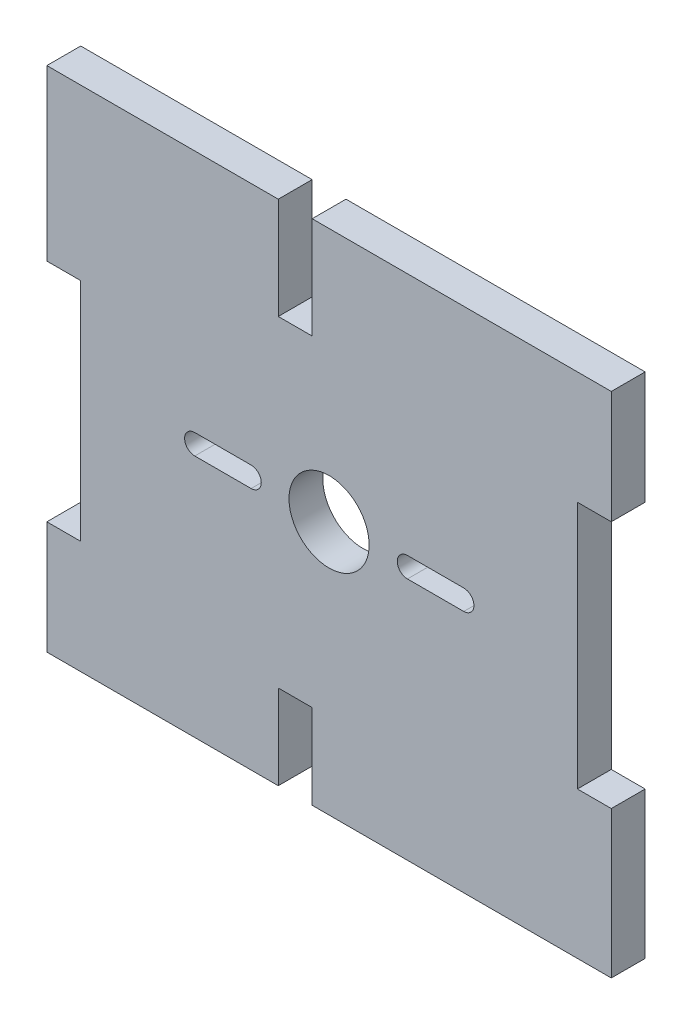
ISO-10303-21;
HEADER;
FILE_DESCRIPTION(('STEP AP214'),'2;1');
FILE_NAME('part.step','',(''),(''),'','','');
FILE_SCHEMA(('AUTOMOTIVE_DESIGN { 1 0 10303 214 1 1 1 1 }'));
ENDSEC;
DATA;
#1=APPLICATION_CONTEXT('core data for automotive mechanical design processes');
#2=APPLICATION_PROTOCOL_DEFINITION('international standard','automotive_design',2000,#1);
#3=PRODUCT_CONTEXT('',#1,'mechanical');
#4=PRODUCT('Part','Part','',(#3));
#5=PRODUCT_RELATED_PRODUCT_CATEGORY('part','',(#4));
#6=PRODUCT_DEFINITION_FORMATION('','',#4);
#7=PRODUCT_DEFINITION_CONTEXT('part definition',#1,'design');
#8=PRODUCT_DEFINITION('design','',#6,#7);
#9=PRODUCT_DEFINITION_SHAPE('','',#8);
#10=(LENGTH_UNIT() NAMED_UNIT(*) SI_UNIT(.MILLI.,.METRE.));
#11=(NAMED_UNIT(*) PLANE_ANGLE_UNIT() SI_UNIT($,.RADIAN.));
#12=(NAMED_UNIT(*) SI_UNIT($,.STERADIAN.) SOLID_ANGLE_UNIT());
#13=UNCERTAINTY_MEASURE_WITH_UNIT(LENGTH_MEASURE(1.E-05),#10,'distance_accuracy_value','');
#14=(GEOMETRIC_REPRESENTATION_CONTEXT(3) GLOBAL_UNCERTAINTY_ASSIGNED_CONTEXT((#13)) GLOBAL_UNIT_ASSIGNED_CONTEXT((#10,
#11,#12)) REPRESENTATION_CONTEXT('',''));
#15=CARTESIAN_POINT('',(0.,0.,0.));
#16=DIRECTION('',(0.,0.,1.));
#17=DIRECTION('',(1.,0.,0.));
#18=AXIS2_PLACEMENT_3D('',#15,#16,#17);
#19=CARTESIAN_POINT('',(46.1318585041378,34.9994,0.));
#20=DIRECTION('',(1.,0.,0.));
#21=DIRECTION('',(0.,0.,-1.));
#22=AXIS2_PLACEMENT_3D('',#19,#20,#21);
#23=PLANE('',#22);
#24=DIRECTION('',(0.,1.,0.));
#25=VECTOR('',#24,1.);
#26=CARTESIAN_POINT('',(46.1318585041378,34.9994,3.));
#27=LINE('',#26,#25);
#28=CARTESIAN_POINT('',(46.1318585041378,34.9994,3.));
#29=VERTEX_POINT('',#28);
#30=CARTESIAN_POINT('',(46.1318585041378,44.9999,3.));
#31=VERTEX_POINT('',#30);
#32=EDGE_CURVE('E288',#29,#31,#27,.T.);
#33=ORIENTED_EDGE('',*,*,#32,.F.);
#34=DIRECTION('',(0.,0.,1.));
#35=VECTOR('',#34,1.);
#36=CARTESIAN_POINT('',(46.1318585041378,34.9994,0.));
#37=LINE('',#36,#35);
#38=CARTESIAN_POINT('',(46.1318585041378,34.9994,0.));
#39=VERTEX_POINT('',#38);
#40=EDGE_CURVE('E11',#39,#29,#37,.T.);
#41=ORIENTED_EDGE('',*,*,#40,.F.);
#42=DIRECTION('',(0.,1.,0.));
#43=VECTOR('',#42,1.);
#44=CARTESIAN_POINT('',(46.1318585041378,34.9994,0.));
#45=LINE('',#44,#43);
#46=CARTESIAN_POINT('',(46.1318585041378,44.9999,0.));
#47=VERTEX_POINT('',#46);
#48=EDGE_CURVE('E295',#39,#47,#45,.T.);
#49=ORIENTED_EDGE('',*,*,#48,.T.);
#50=DIRECTION('',(0.,0.,1.));
#51=VECTOR('',#50,1.);
#52=CARTESIAN_POINT('',(46.1318585041378,44.9999,0.));
#53=LINE('',#52,#51);
#54=EDGE_CURVE('E40',#47,#31,#53,.T.);
#55=ORIENTED_EDGE('',*,*,#54,.T.);
#56=EDGE_LOOP('',(#33,#41,#49,#55));
#57=FACE_BOUND('',#56,.T.);
#58=ADVANCED_FACE('F37',(#57),#23,.T.);
#59=CARTESIAN_POINT('',(43.1318585041378,34.9994,0.));
#60=DIRECTION('',(0.,-1.,0.));
#61=DIRECTION('',(0.,0.,-1.));
#62=AXIS2_PLACEMENT_3D('',#59,#60,#61);
#63=PLANE('',#62);
#64=DIRECTION('',(1.,0.,0.));
#65=VECTOR('',#64,1.);
#66=CARTESIAN_POINT('',(43.1318585041378,34.9994,3.));
#67=LINE('',#66,#65);
#68=CARTESIAN_POINT('',(43.1318585041378,34.9994,3.));
#69=VERTEX_POINT('',#68);
#70=EDGE_CURVE('E299',#69,#29,#67,.T.);
#71=ORIENTED_EDGE('',*,*,#70,.F.);
#72=DIRECTION('',(0.,0.,1.));
#73=VECTOR('',#72,1.);
#74=CARTESIAN_POINT('',(43.1318585041378,34.9994,0.));
#75=LINE('',#74,#73);
#76=CARTESIAN_POINT('',(43.1318585041378,34.9994,0.));
#77=VERTEX_POINT('',#76);
#78=EDGE_CURVE('E45',#77,#69,#75,.T.);
#79=ORIENTED_EDGE('',*,*,#78,.F.);
#80=DIRECTION('',(1.,0.,0.));
#81=VECTOR('',#80,1.);
#82=CARTESIAN_POINT('',(43.1318585041378,34.9994,0.));
#83=LINE('',#82,#81);
#84=EDGE_CURVE('E353',#77,#39,#83,.T.);
#85=ORIENTED_EDGE('',*,*,#84,.T.);
#86=ORIENTED_EDGE('',*,*,#40,.T.);
#87=EDGE_LOOP('',(#71,#79,#85,#86));
#88=FACE_BOUND('',#87,.T.);
#89=ADVANCED_FACE('F460',(#88),#63,.T.);
#90=CARTESIAN_POINT('',(43.1318585041378,13.0005,0.));
#91=DIRECTION('',(1.,0.,0.));
#92=DIRECTION('',(0.,0.,-1.));
#93=AXIS2_PLACEMENT_3D('',#90,#91,#92);
#94=PLANE('',#93);
#95=DIRECTION('',(0.,1.,0.));
#96=VECTOR('',#95,1.);
#97=CARTESIAN_POINT('',(43.1318585041378,13.0005,3.));
#98=LINE('',#97,#96);
#99=CARTESIAN_POINT('',(43.1318585041378,13.0005,3.));
#100=VERTEX_POINT('',#99);
#101=EDGE_CURVE('E409',#100,#69,#98,.T.);
#102=ORIENTED_EDGE('',*,*,#101,.F.);
#103=DIRECTION('',(0.,0.,1.));
#104=VECTOR('',#103,1.);
#105=CARTESIAN_POINT('',(43.1318585041378,13.0005,0.));
#106=LINE('',#105,#104);
#107=CARTESIAN_POINT('',(43.1318585041378,13.0005,0.));
#108=VERTEX_POINT('',#107);
#109=EDGE_CURVE('E415',#108,#100,#106,.T.);
#110=ORIENTED_EDGE('',*,*,#109,.F.);
#111=DIRECTION('',(0.,1.,0.));
#112=VECTOR('',#111,1.);
#113=CARTESIAN_POINT('',(43.1318585041378,13.0005,0.));
#114=LINE('',#113,#112);
#115=EDGE_CURVE('E350',#108,#77,#114,.T.);
#116=ORIENTED_EDGE('',*,*,#115,.T.);
#117=ORIENTED_EDGE('',*,*,#78,.T.);
#118=EDGE_LOOP('',(#102,#110,#116,#117));
#119=FACE_BOUND('',#118,.T.);
#120=ADVANCED_FACE('F528',(#119),#94,.T.);
#121=CARTESIAN_POINT('',(46.1318585041378,13.0005,0.));
#122=DIRECTION('',(0.,1.,0.));
#123=DIRECTION('',(0.,0.,1.));
#124=AXIS2_PLACEMENT_3D('',#121,#122,#123);
#125=PLANE('',#124);
#126=DIRECTION('',(-1.,0.,0.));
#127=VECTOR('',#126,1.);
#128=CARTESIAN_POINT('',(46.1318585041378,13.0005,3.));
#129=LINE('',#128,#127);
#130=CARTESIAN_POINT('',(46.1318585041378,13.0005,3.));
#131=VERTEX_POINT('',#130);
#132=EDGE_CURVE('E406',#131,#100,#129,.T.);
#133=ORIENTED_EDGE('',*,*,#132,.F.);
#134=DIRECTION('',(0.,0.,1.));
#135=VECTOR('',#134,1.);
#136=CARTESIAN_POINT('',(46.1318585041378,13.0005,0.));
#137=LINE('',#136,#135);
#138=CARTESIAN_POINT('',(46.1318585041378,13.0005,0.));
#139=VERTEX_POINT('',#138);
#140=EDGE_CURVE('E417',#139,#131,#137,.T.);
#141=ORIENTED_EDGE('',*,*,#140,.F.);
#142=DIRECTION('',(-1.,0.,0.));
#143=VECTOR('',#142,1.);
#144=CARTESIAN_POINT('',(46.1318585041378,13.0005,0.));
#145=LINE('',#144,#143);
#146=EDGE_CURVE('E347',#139,#108,#145,.T.);
#147=ORIENTED_EDGE('',*,*,#146,.T.);
#148=ORIENTED_EDGE('',*,*,#109,.T.);
#149=EDGE_LOOP('',(#133,#141,#147,#148));
#150=FACE_BOUND('',#149,.T.);
#151=ADVANCED_FACE('F526',(#150),#125,.T.);
#152=CARTESIAN_POINT('',(46.1318585041378,0.,0.));
#153=DIRECTION('',(1.,0.,0.));
#154=DIRECTION('',(0.,0.,-1.));
#155=AXIS2_PLACEMENT_3D('',#152,#153,#154);
#156=PLANE('',#155);
#157=DIRECTION('',(0.,1.,0.));
#158=VECTOR('',#157,1.);
#159=CARTESIAN_POINT('',(46.1318585041378,0.,3.));
#160=LINE('',#159,#158);
#161=CARTESIAN_POINT('',(46.1318585041378,0.,3.));
#162=VERTEX_POINT('',#161);
#163=EDGE_CURVE('E403',#162,#131,#160,.T.);
#164=ORIENTED_EDGE('',*,*,#163,.F.);
#165=DIRECTION('',(0.,0.,1.));
#166=VECTOR('',#165,1.);
#167=CARTESIAN_POINT('',(46.1318585041378,0.,0.));
#168=LINE('',#167,#166);
#169=CARTESIAN_POINT('',(46.1318585041378,0.,0.));
#170=VERTEX_POINT('',#169);
#171=EDGE_CURVE('E419',#170,#162,#168,.T.);
#172=ORIENTED_EDGE('',*,*,#171,.F.);
#173=DIRECTION('',(0.,1.,0.));
#174=VECTOR('',#173,1.);
#175=CARTESIAN_POINT('',(46.1318585041378,0.,0.));
#176=LINE('',#175,#174);
#177=EDGE_CURVE('E344',#170,#139,#176,.T.);
#178=ORIENTED_EDGE('',*,*,#177,.T.);
#179=ORIENTED_EDGE('',*,*,#140,.T.);
#180=EDGE_LOOP('',(#164,#172,#178,#179));
#181=FACE_BOUND('',#180,.T.);
#182=ADVANCED_FACE('F522',(#181),#156,.T.);
#183=CARTESIAN_POINT('',(19.6323885041378,0.,0.));
#184=DIRECTION('',(0.,-1.,0.));
#185=DIRECTION('',(0.,0.,-1.));
#186=AXIS2_PLACEMENT_3D('',#183,#184,#185);
#187=PLANE('',#186);
#188=DIRECTION('',(1.,0.,0.));
#189=VECTOR('',#188,1.);
#190=CARTESIAN_POINT('',(19.6323885041378,0.,3.));
#191=LINE('',#190,#189);
#192=CARTESIAN_POINT('',(19.6323885041378,0.,3.));
#193=VERTEX_POINT('',#192);
#194=EDGE_CURVE('E400',#193,#162,#191,.T.);
#195=ORIENTED_EDGE('',*,*,#194,.F.);
#196=DIRECTION('',(0.,0.,1.));
#197=VECTOR('',#196,1.);
#198=CARTESIAN_POINT('',(19.6323885041378,0.,0.));
#199=LINE('',#198,#197);
#200=CARTESIAN_POINT('',(19.6323885041378,0.,0.));
#201=VERTEX_POINT('',#200);
#202=EDGE_CURVE('E421',#201,#193,#199,.T.);
#203=ORIENTED_EDGE('',*,*,#202,.F.);
#204=DIRECTION('',(1.,0.,0.));
#205=VECTOR('',#204,1.);
#206=CARTESIAN_POINT('',(19.6323885041378,0.,0.));
#207=LINE('',#206,#205);
#208=EDGE_CURVE('E341',#201,#170,#207,.T.);
#209=ORIENTED_EDGE('',*,*,#208,.T.);
#210=ORIENTED_EDGE('',*,*,#171,.T.);
#211=EDGE_LOOP('',(#195,#203,#209,#210));
#212=FACE_BOUND('',#211,.T.);
#213=ADVANCED_FACE('F518',(#212),#187,.T.);
#214=CARTESIAN_POINT('',(19.6323885041378,7.4993,0.));
#215=DIRECTION('',(-1.,0.,0.));
#216=DIRECTION('',(0.,0.,1.));
#217=AXIS2_PLACEMENT_3D('',#214,#215,#216);
#218=PLANE('',#217);
#219=DIRECTION('',(0.,-1.,0.));
#220=VECTOR('',#219,1.);
#221=CARTESIAN_POINT('',(19.6323885041378,7.4993,3.));
#222=LINE('',#221,#220);
#223=CARTESIAN_POINT('',(19.6323885041378,7.4993,3.));
#224=VERTEX_POINT('',#223);
#225=EDGE_CURVE('E397',#224,#193,#222,.T.);
#226=ORIENTED_EDGE('',*,*,#225,.F.);
#227=DIRECTION('',(0.,0.,1.));
#228=VECTOR('',#227,1.);
#229=CARTESIAN_POINT('',(19.6323885041378,7.4993,0.));
#230=LINE('',#229,#228);
#231=CARTESIAN_POINT('',(19.6323885041378,7.4993,0.));
#232=VERTEX_POINT('',#231);
#233=EDGE_CURVE('E423',#232,#224,#230,.T.);
#234=ORIENTED_EDGE('',*,*,#233,.F.);
#235=DIRECTION('',(0.,-1.,0.));
#236=VECTOR('',#235,1.);
#237=CARTESIAN_POINT('',(19.6323885041378,7.4993,0.));
#238=LINE('',#237,#236);
#239=EDGE_CURVE('E338',#232,#201,#238,.T.);
#240=ORIENTED_EDGE('',*,*,#239,.T.);
#241=ORIENTED_EDGE('',*,*,#202,.T.);
#242=EDGE_LOOP('',(#226,#234,#240,#241));
#243=FACE_BOUND('',#242,.T.);
#244=ADVANCED_FACE('F514',(#243),#218,.T.);
#245=CARTESIAN_POINT('',(16.6323585041377,7.4993,0.));
#246=DIRECTION('',(0.,-1.,0.));
#247=DIRECTION('',(0.,0.,-1.));
#248=AXIS2_PLACEMENT_3D('',#245,#246,#247);
#249=PLANE('',#248);
#250=DIRECTION('',(1.,0.,0.));
#251=VECTOR('',#250,1.);
#252=CARTESIAN_POINT('',(16.6323585041377,7.4993,3.));
#253=LINE('',#252,#251);
#254=CARTESIAN_POINT('',(16.6323585041377,7.4993,3.));
#255=VERTEX_POINT('',#254);
#256=EDGE_CURVE('E394',#255,#224,#253,.T.);
#257=ORIENTED_EDGE('',*,*,#256,.F.);
#258=DIRECTION('',(0.,0.,1.));
#259=VECTOR('',#258,1.);
#260=CARTESIAN_POINT('',(16.6323585041377,7.4993,0.));
#261=LINE('',#260,#259);
#262=CARTESIAN_POINT('',(16.6323585041377,7.4993,0.));
#263=VERTEX_POINT('',#262);
#264=EDGE_CURVE('E425',#263,#255,#261,.T.);
#265=ORIENTED_EDGE('',*,*,#264,.F.);
#266=DIRECTION('',(1.,0.,0.));
#267=VECTOR('',#266,1.);
#268=CARTESIAN_POINT('',(16.6323585041377,7.4993,0.));
#269=LINE('',#268,#267);
#270=EDGE_CURVE('E335',#263,#232,#269,.T.);
#271=ORIENTED_EDGE('',*,*,#270,.T.);
#272=ORIENTED_EDGE('',*,*,#233,.T.);
#273=EDGE_LOOP('',(#257,#265,#271,#272));
#274=FACE_BOUND('',#273,.T.);
#275=ADVANCED_FACE('F510',(#274),#249,.T.);
#276=CARTESIAN_POINT('',(16.6323585041377,0.,0.));
#277=DIRECTION('',(1.,0.,0.));
#278=DIRECTION('',(0.,0.,-1.));
#279=AXIS2_PLACEMENT_3D('',#276,#277,#278);
#280=PLANE('',#279);
#281=DIRECTION('',(0.,1.,0.));
#282=VECTOR('',#281,1.);
#283=CARTESIAN_POINT('',(16.6323585041377,0.,3.));
#284=LINE('',#283,#282);
#285=CARTESIAN_POINT('',(16.6323585041377,0.,3.));
#286=VERTEX_POINT('',#285);
#287=EDGE_CURVE('E391',#286,#255,#284,.T.);
#288=ORIENTED_EDGE('',*,*,#287,.F.);
#289=DIRECTION('',(0.,0.,1.));
#290=VECTOR('',#289,1.);
#291=CARTESIAN_POINT('',(16.6323585041377,0.,0.));
#292=LINE('',#291,#290);
#293=CARTESIAN_POINT('',(16.6323585041377,0.,0.));
#294=VERTEX_POINT('',#293);
#295=EDGE_CURVE('E427',#294,#286,#292,.T.);
#296=ORIENTED_EDGE('',*,*,#295,.F.);
#297=DIRECTION('',(0.,1.,0.));
#298=VECTOR('',#297,1.);
#299=CARTESIAN_POINT('',(16.6323585041377,0.,0.));
#300=LINE('',#299,#298);
#301=EDGE_CURVE('E332',#294,#263,#300,.T.);
#302=ORIENTED_EDGE('',*,*,#301,.T.);
#303=ORIENTED_EDGE('',*,*,#264,.T.);
#304=EDGE_LOOP('',(#288,#296,#302,#303));
#305=FACE_BOUND('',#304,.T.);
#306=ADVANCED_FACE('F506',(#305),#280,.T.);
#307=CARTESIAN_POINT('',(-3.86737149586228,0.,0.));
#308=DIRECTION('',(0.,-1.,0.));
#309=DIRECTION('',(0.,0.,-1.));
#310=AXIS2_PLACEMENT_3D('',#307,#308,#309);
#311=PLANE('',#310);
#312=DIRECTION('',(1.,0.,0.));
#313=VECTOR('',#312,1.);
#314=CARTESIAN_POINT('',(-3.86737149586228,0.,3.));
#315=LINE('',#314,#313);
#316=CARTESIAN_POINT('',(-3.86737149586228,0.,3.));
#317=VERTEX_POINT('',#316);
#318=EDGE_CURVE('E388',#317,#286,#315,.T.);
#319=ORIENTED_EDGE('',*,*,#318,.F.);
#320=DIRECTION('',(0.,0.,1.));
#321=VECTOR('',#320,1.);
#322=CARTESIAN_POINT('',(-3.86737149586228,0.,0.));
#323=LINE('',#322,#321);
#324=CARTESIAN_POINT('',(-3.86737149586228,0.,0.));
#325=VERTEX_POINT('',#324);
#326=EDGE_CURVE('E429',#325,#317,#323,.T.);
#327=ORIENTED_EDGE('',*,*,#326,.F.);
#328=DIRECTION('',(1.,0.,0.));
#329=VECTOR('',#328,1.);
#330=CARTESIAN_POINT('',(-3.86737149586228,0.,0.));
#331=LINE('',#330,#329);
#332=EDGE_CURVE('E329',#325,#294,#331,.T.);
#333=ORIENTED_EDGE('',*,*,#332,.T.);
#334=ORIENTED_EDGE('',*,*,#295,.T.);
#335=EDGE_LOOP('',(#319,#327,#333,#334));
#336=FACE_BOUND('',#335,.T.);
#337=ADVANCED_FACE('F502',(#336),#311,.T.);
#338=CARTESIAN_POINT('',(-3.86737149586228,9.9991,0.));
#339=DIRECTION('',(-1.,0.,0.));
#340=DIRECTION('',(0.,0.,1.));
#341=AXIS2_PLACEMENT_3D('',#338,#339,#340);
#342=PLANE('',#341);
#343=DIRECTION('',(0.,-1.,0.));
#344=VECTOR('',#343,1.);
#345=CARTESIAN_POINT('',(-3.86737149586228,9.9991,3.));
#346=LINE('',#345,#344);
#347=CARTESIAN_POINT('',(-3.86737149586228,9.9991,3.));
#348=VERTEX_POINT('',#347);
#349=EDGE_CURVE('E385',#348,#317,#346,.T.);
#350=ORIENTED_EDGE('',*,*,#349,.F.);
#351=DIRECTION('',(0.,0.,1.));
#352=VECTOR('',#351,1.);
#353=CARTESIAN_POINT('',(-3.86737149586228,9.9991,0.));
#354=LINE('',#353,#352);
#355=CARTESIAN_POINT('',(-3.86737149586228,9.9991,0.));
#356=VERTEX_POINT('',#355);
#357=EDGE_CURVE('E431',#356,#348,#354,.T.);
#358=ORIENTED_EDGE('',*,*,#357,.F.);
#359=DIRECTION('',(0.,-1.,0.));
#360=VECTOR('',#359,1.);
#361=CARTESIAN_POINT('',(-3.86737149586228,9.9991,0.));
#362=LINE('',#361,#360);
#363=EDGE_CURVE('E326',#356,#325,#362,.T.);
#364=ORIENTED_EDGE('',*,*,#363,.T.);
#365=ORIENTED_EDGE('',*,*,#326,.T.);
#366=EDGE_LOOP('',(#350,#358,#364,#365));
#367=FACE_BOUND('',#366,.T.);
#368=ADVANCED_FACE('F498',(#367),#342,.T.);
#369=CARTESIAN_POINT('',(-0.867341495862278,9.9991,0.));
#370=DIRECTION('',(0.,1.,0.));
#371=DIRECTION('',(0.,0.,1.));
#372=AXIS2_PLACEMENT_3D('',#369,#370,#371);
#373=PLANE('',#372);
#374=DIRECTION('',(-1.,0.,0.));
#375=VECTOR('',#374,1.);
#376=CARTESIAN_POINT('',(-0.867341495862278,9.9991,3.));
#377=LINE('',#376,#375);
#378=CARTESIAN_POINT('',(-0.867341495862278,9.9991,3.));
#379=VERTEX_POINT('',#378);
#380=EDGE_CURVE('E382',#379,#348,#377,.T.);
#381=ORIENTED_EDGE('',*,*,#380,.F.);
#382=DIRECTION('',(0.,0.,1.));
#383=VECTOR('',#382,1.);
#384=CARTESIAN_POINT('',(-0.867341495862278,9.9991,0.));
#385=LINE('',#384,#383);
#386=CARTESIAN_POINT('',(-0.867341495862278,9.9991,0.));
#387=VERTEX_POINT('',#386);
#388=EDGE_CURVE('E433',#387,#379,#385,.T.);
#389=ORIENTED_EDGE('',*,*,#388,.F.);
#390=DIRECTION('',(-1.,0.,0.));
#391=VECTOR('',#390,1.);
#392=CARTESIAN_POINT('',(-0.867341495862278,9.9991,0.));
#393=LINE('',#392,#391);
#394=EDGE_CURVE('E323',#387,#356,#393,.T.);
#395=ORIENTED_EDGE('',*,*,#394,.T.);
#396=ORIENTED_EDGE('',*,*,#357,.T.);
#397=EDGE_LOOP('',(#381,#389,#395,#396));
#398=FACE_BOUND('',#397,.T.);
#399=ADVANCED_FACE('F494',(#398),#373,.T.);
#400=CARTESIAN_POINT('',(-0.867341495862278,29.9998,0.));
#401=DIRECTION('',(-1.,0.,0.));
#402=DIRECTION('',(0.,0.,1.));
#403=AXIS2_PLACEMENT_3D('',#400,#401,#402);
#404=PLANE('',#403);
#405=DIRECTION('',(0.,-1.,0.));
#406=VECTOR('',#405,1.);
#407=CARTESIAN_POINT('',(-0.867341495862278,29.9998,3.));
#408=LINE('',#407,#406);
#409=CARTESIAN_POINT('',(-0.867341495862278,29.9998,3.));
#410=VERTEX_POINT('',#409);
#411=EDGE_CURVE('E379',#410,#379,#408,.T.);
#412=ORIENTED_EDGE('',*,*,#411,.F.);
#413=DIRECTION('',(0.,0.,1.));
#414=VECTOR('',#413,1.);
#415=CARTESIAN_POINT('',(-0.867341495862278,29.9998,0.));
#416=LINE('',#415,#414);
#417=CARTESIAN_POINT('',(-0.867341495862278,29.9998,0.));
#418=VERTEX_POINT('',#417);
#419=EDGE_CURVE('E435',#418,#410,#416,.T.);
#420=ORIENTED_EDGE('',*,*,#419,.F.);
#421=DIRECTION('',(0.,-1.,0.));
#422=VECTOR('',#421,1.);
#423=CARTESIAN_POINT('',(-0.867341495862278,29.9998,0.));
#424=LINE('',#423,#422);
#425=EDGE_CURVE('E320',#418,#387,#424,.T.);
#426=ORIENTED_EDGE('',*,*,#425,.T.);
#427=ORIENTED_EDGE('',*,*,#388,.T.);
#428=EDGE_LOOP('',(#412,#420,#426,#427));
#429=FACE_BOUND('',#428,.T.);
#430=ADVANCED_FACE('F490',(#429),#404,.T.);
#431=CARTESIAN_POINT('',(-3.86737149586228,29.9998,0.));
#432=DIRECTION('',(0.,-1.,0.));
#433=DIRECTION('',(0.,0.,-1.));
#434=AXIS2_PLACEMENT_3D('',#431,#432,#433);
#435=PLANE('',#434);
#436=DIRECTION('',(1.,0.,0.));
#437=VECTOR('',#436,1.);
#438=CARTESIAN_POINT('',(-3.86737149586228,29.9998,3.));
#439=LINE('',#438,#437);
#440=CARTESIAN_POINT('',(-3.86737149586228,29.9998,3.));
#441=VERTEX_POINT('',#440);
#442=EDGE_CURVE('E376',#441,#410,#439,.T.);
#443=ORIENTED_EDGE('',*,*,#442,.F.);
#444=DIRECTION('',(0.,0.,1.));
#445=VECTOR('',#444,1.);
#446=CARTESIAN_POINT('',(-3.86737149586228,29.9998,0.));
#447=LINE('',#446,#445);
#448=CARTESIAN_POINT('',(-3.86737149586228,29.9998,0.));
#449=VERTEX_POINT('',#448);
#450=EDGE_CURVE('E437',#449,#441,#447,.T.);
#451=ORIENTED_EDGE('',*,*,#450,.F.);
#452=DIRECTION('',(1.,0.,0.));
#453=VECTOR('',#452,1.);
#454=CARTESIAN_POINT('',(-3.86737149586228,29.9998,0.));
#455=LINE('',#454,#453);
#456=EDGE_CURVE('E317',#449,#418,#455,.T.);
#457=ORIENTED_EDGE('',*,*,#456,.T.);
#458=ORIENTED_EDGE('',*,*,#419,.T.);
#459=EDGE_LOOP('',(#443,#451,#457,#458));
#460=FACE_BOUND('',#459,.T.);
#461=ADVANCED_FACE('F486',(#460),#435,.T.);
#462=CARTESIAN_POINT('',(-3.86737149586228,44.9999,0.));
#463=DIRECTION('',(-1.,0.,0.));
#464=DIRECTION('',(0.,-1.,0.));
#465=AXIS2_PLACEMENT_3D('',#462,#463,#464);
#466=PLANE('',#465);
#467=DIRECTION('',(0.,-1.,0.));
#468=VECTOR('',#467,1.);
#469=CARTESIAN_POINT('',(-3.86737149586228,44.9999,3.));
#470=LINE('',#469,#468);
#471=CARTESIAN_POINT('',(-3.86737149586228,44.9999,3.));
#472=VERTEX_POINT('',#471);
#473=EDGE_CURVE('E373',#472,#441,#470,.T.);
#474=ORIENTED_EDGE('',*,*,#473,.F.);
#475=DIRECTION('',(0.,0.,1.));
#476=VECTOR('',#475,1.);
#477=CARTESIAN_POINT('',(-3.86737149586228,44.9999,0.));
#478=LINE('',#477,#476);
#479=CARTESIAN_POINT('',(-3.86737149586228,44.9999,0.));
#480=VERTEX_POINT('',#479);
#481=EDGE_CURVE('E439',#480,#472,#478,.T.);
#482=ORIENTED_EDGE('',*,*,#481,.F.);
#483=DIRECTION('',(0.,-1.,0.));
#484=VECTOR('',#483,1.);
#485=CARTESIAN_POINT('',(-3.86737149586228,44.9999,0.));
#486=LINE('',#485,#484);
#487=EDGE_CURVE('E314',#480,#449,#486,.T.);
#488=ORIENTED_EDGE('',*,*,#487,.T.);
#489=ORIENTED_EDGE('',*,*,#450,.T.);
#490=EDGE_LOOP('',(#474,#482,#488,#489));
#491=FACE_BOUND('',#490,.T.);
#492=ADVANCED_FACE('F482',(#491),#466,.T.);
#493=CARTESIAN_POINT('',(16.6323585041377,44.9999,0.));
#494=DIRECTION('',(0.,1.,0.));
#495=DIRECTION('',(0.,0.,1.));
#496=AXIS2_PLACEMENT_3D('',#493,#494,#495);
#497=PLANE('',#496);
#498=DIRECTION('',(-1.,0.,0.));
#499=VECTOR('',#498,1.);
#500=CARTESIAN_POINT('',(16.6323585041377,44.9999,3.));
#501=LINE('',#500,#499);
#502=CARTESIAN_POINT('',(16.6323585041377,44.9999,3.));
#503=VERTEX_POINT('',#502);
#504=EDGE_CURVE('E370',#503,#472,#501,.T.);
#505=ORIENTED_EDGE('',*,*,#504,.F.);
#506=DIRECTION('',(0.,0.,1.));
#507=VECTOR('',#506,1.);
#508=CARTESIAN_POINT('',(16.6323585041377,44.9999,0.));
#509=LINE('',#508,#507);
#510=CARTESIAN_POINT('',(16.6323585041377,44.9999,0.));
#511=VERTEX_POINT('',#510);
#512=EDGE_CURVE('E441',#511,#503,#509,.T.);
#513=ORIENTED_EDGE('',*,*,#512,.F.);
#514=DIRECTION('',(-1.,0.,0.));
#515=VECTOR('',#514,1.);
#516=CARTESIAN_POINT('',(16.6323585041377,44.9999,0.));
#517=LINE('',#516,#515);
#518=EDGE_CURVE('E311',#511,#480,#517,.T.);
#519=ORIENTED_EDGE('',*,*,#518,.T.);
#520=ORIENTED_EDGE('',*,*,#481,.T.);
#521=EDGE_LOOP('',(#505,#513,#519,#520));
#522=FACE_BOUND('',#521,.T.);
#523=ADVANCED_FACE('F478',(#522),#497,.T.);
#524=CARTESIAN_POINT('',(16.6323585041377,35.9998,0.));
#525=DIRECTION('',(1.,0.,0.));
#526=DIRECTION('',(0.,0.,-1.));
#527=AXIS2_PLACEMENT_3D('',#524,#525,#526);
#528=PLANE('',#527);
#529=DIRECTION('',(0.,1.,0.));
#530=VECTOR('',#529,1.);
#531=CARTESIAN_POINT('',(16.6323585041377,35.9998,3.));
#532=LINE('',#531,#530);
#533=CARTESIAN_POINT('',(16.6323585041377,35.9998,3.));
#534=VERTEX_POINT('',#533);
#535=EDGE_CURVE('E367',#534,#503,#532,.T.);
#536=ORIENTED_EDGE('',*,*,#535,.F.);
#537=DIRECTION('',(0.,0.,1.));
#538=VECTOR('',#537,1.);
#539=CARTESIAN_POINT('',(16.6323585041377,35.9998,0.));
#540=LINE('',#539,#538);
#541=CARTESIAN_POINT('',(16.6323585041377,35.9998,0.));
#542=VERTEX_POINT('',#541);
#543=EDGE_CURVE('E443',#542,#534,#540,.T.);
#544=ORIENTED_EDGE('',*,*,#543,.F.);
#545=DIRECTION('',(0.,1.,0.));
#546=VECTOR('',#545,1.);
#547=CARTESIAN_POINT('',(16.6323585041377,35.9998,0.));
#548=LINE('',#547,#546);
#549=EDGE_CURVE('E308',#542,#511,#548,.T.);
#550=ORIENTED_EDGE('',*,*,#549,.T.);
#551=ORIENTED_EDGE('',*,*,#512,.T.);
#552=EDGE_LOOP('',(#536,#544,#550,#551));
#553=FACE_BOUND('',#552,.T.);
#554=ADVANCED_FACE('F474',(#553),#528,.T.);
#555=CARTESIAN_POINT('',(19.6323885041378,35.9998,0.));
#556=DIRECTION('',(0.,1.,0.));
#557=DIRECTION('',(0.,0.,1.));
#558=AXIS2_PLACEMENT_3D('',#555,#556,#557);
#559=PLANE('',#558);
#560=DIRECTION('',(-1.,0.,0.));
#561=VECTOR('',#560,1.);
#562=CARTESIAN_POINT('',(19.6323885041378,35.9998,3.));
#563=LINE('',#562,#561);
#564=CARTESIAN_POINT('',(19.6323885041378,35.9998,3.));
#565=VERTEX_POINT('',#564);
#566=EDGE_CURVE('E364',#565,#534,#563,.T.);
#567=ORIENTED_EDGE('',*,*,#566,.F.);
#568=DIRECTION('',(0.,0.,1.));
#569=VECTOR('',#568,1.);
#570=CARTESIAN_POINT('',(19.6323885041378,35.9998,0.));
#571=LINE('',#570,#569);
#572=CARTESIAN_POINT('',(19.6323885041378,35.9998,0.));
#573=VERTEX_POINT('',#572);
#574=EDGE_CURVE('E445',#573,#565,#571,.T.);
#575=ORIENTED_EDGE('',*,*,#574,.F.);
#576=DIRECTION('',(-1.,0.,0.));
#577=VECTOR('',#576,1.);
#578=CARTESIAN_POINT('',(19.6323885041378,35.9998,0.));
#579=LINE('',#578,#577);
#580=EDGE_CURVE('E305',#573,#542,#579,.T.);
#581=ORIENTED_EDGE('',*,*,#580,.T.);
#582=ORIENTED_EDGE('',*,*,#543,.T.);
#583=EDGE_LOOP('',(#567,#575,#581,#582));
#584=FACE_BOUND('',#583,.T.);
#585=ADVANCED_FACE('F472',(#584),#559,.T.);
#586=CARTESIAN_POINT('',(19.6323885041378,44.9999,0.));
#587=DIRECTION('',(-1.,0.,0.));
#588=DIRECTION('',(0.,-1.,0.));
#589=AXIS2_PLACEMENT_3D('',#586,#587,#588);
#590=PLANE('',#589);
#591=DIRECTION('',(0.,-1.,0.));
#592=VECTOR('',#591,1.);
#593=CARTESIAN_POINT('',(19.6323885041378,44.9999,3.));
#594=LINE('',#593,#592);
#595=CARTESIAN_POINT('',(19.6323885041378,44.9999,3.));
#596=VERTEX_POINT('',#595);
#597=EDGE_CURVE('E361',#596,#565,#594,.T.);
#598=ORIENTED_EDGE('',*,*,#597,.F.);
#599=DIRECTION('',(0.,0.,1.));
#600=VECTOR('',#599,1.);
#601=CARTESIAN_POINT('',(19.6323885041378,44.9999,0.));
#602=LINE('',#601,#600);
#603=CARTESIAN_POINT('',(19.6323885041378,44.9999,0.));
#604=VERTEX_POINT('',#603);
#605=EDGE_CURVE('E446',#604,#596,#602,.T.);
#606=ORIENTED_EDGE('',*,*,#605,.F.);
#607=DIRECTION('',(0.,-1.,0.));
#608=VECTOR('',#607,1.);
#609=CARTESIAN_POINT('',(19.6323885041378,44.9999,0.));
#610=LINE('',#609,#608);
#611=EDGE_CURVE('E302',#604,#573,#610,.T.);
#612=ORIENTED_EDGE('',*,*,#611,.T.);
#613=ORIENTED_EDGE('',*,*,#574,.T.);
#614=EDGE_LOOP('',(#598,#606,#612,#613));
#615=FACE_BOUND('',#614,.T.);
#616=ADVANCED_FACE('F468',(#615),#590,.T.);
#617=CARTESIAN_POINT('',(46.1318585041378,44.9999,0.));
#618=DIRECTION('',(0.,1.,0.));
#619=DIRECTION('',(-1.,0.,0.));
#620=AXIS2_PLACEMENT_3D('',#617,#618,#619);
#621=PLANE('',#620);
#622=DIRECTION('',(-1.,0.,0.));
#623=VECTOR('',#622,1.);
#624=CARTESIAN_POINT('',(46.1318585041378,44.9999,3.));
#625=LINE('',#624,#623);
#626=EDGE_CURVE('E358',#31,#596,#625,.T.);
#627=ORIENTED_EDGE('',*,*,#626,.F.);
#628=ORIENTED_EDGE('',*,*,#54,.F.);
#629=DIRECTION('',(-1.,0.,0.));
#630=VECTOR('',#629,1.);
#631=CARTESIAN_POINT('',(46.1318585041378,44.9999,0.));
#632=LINE('',#631,#630);
#633=EDGE_CURVE('E298',#47,#604,#632,.T.);
#634=ORIENTED_EDGE('',*,*,#633,.T.);
#635=ORIENTED_EDGE('',*,*,#605,.T.);
#636=EDGE_LOOP('',(#627,#628,#634,#635));
#637=FACE_BOUND('',#636,.T.);
#638=ADVANCED_FACE('F454',(#637),#621,.T.);
#639=CARTESIAN_POINT('',(0.,0.,0.));
#640=DIRECTION('',(0.,0.,1.));
#641=DIRECTION('',(1.,0.,0.));
#642=AXIS2_PLACEMENT_3D('',#639,#640,#641);
#643=PLANE('',#642);
#644=CARTESIAN_POINT('',(21.1316585041378,22.4992,0.));
#645=DIRECTION('',(0.,0.,1.));
#646=DIRECTION('',(-1.,0.,0.));
#647=AXIS2_PLACEMENT_3D('',#644,#645,#646);
#648=CIRCLE('',#647,3.55);
#649=CARTESIAN_POINT('',(17.5816585041378,22.4992,0.));
#650=VERTEX_POINT('',#649);
#651=EDGE_CURVE('E253',#650,#650,#648,.T.);
#652=ORIENTED_EDGE('',*,*,#651,.T.);
#653=EDGE_LOOP('',(#652));
#654=FACE_BOUND('',#653,.T.);
#655=DIRECTION('',(1.,0.,0.));
#656=VECTOR('',#655,1.);
#657=CARTESIAN_POINT('',(33.0643894947225,21.5871,0.));
#658=LINE('',#657,#656);
#659=CARTESIAN_POINT('',(28.0744846178231,21.5871,0.));
#660=VERTEX_POINT('',#659);
#661=CARTESIAN_POINT('',(33.0643894947225,21.5871,0.));
#662=VERTEX_POINT('',#661);
#663=EDGE_CURVE('E230',#660,#662,#658,.T.);
#664=ORIENTED_EDGE('',*,*,#663,.T.);
#665=CARTESIAN_POINT('',(33.0643894947225,22.48685,0.));
#666=DIRECTION('',(0.,0.,1.));
#667=DIRECTION('',(-1.,0.,0.));
#668=AXIS2_PLACEMENT_3D('',#665,#666,#667);
#669=CIRCLE('',#668,0.899749999999999);
#670=CARTESIAN_POINT('',(33.0643894947225,23.3866,0.));
#671=VERTEX_POINT('',#670);
#672=EDGE_CURVE('E224',#662,#671,#669,.T.);
#673=ORIENTED_EDGE('',*,*,#672,.T.);
#674=DIRECTION('',(-1.,0.,0.));
#675=VECTOR('',#674,1.);
#676=CARTESIAN_POINT('',(28.0744846178231,23.3866,0.));
#677=LINE('',#676,#675);
#678=CARTESIAN_POINT('',(28.0744846178231,23.3866,0.));
#679=VERTEX_POINT('',#678);
#680=EDGE_CURVE('E233',#671,#679,#677,.T.);
#681=ORIENTED_EDGE('',*,*,#680,.T.);
#682=CARTESIAN_POINT('',(28.0744846178231,22.48685,0.));
#683=DIRECTION('',(0.,0.,1.));
#684=DIRECTION('',(-1.,0.,0.));
#685=AXIS2_PLACEMENT_3D('',#682,#683,#684);
#686=CIRCLE('',#685,0.899750000000001);
#687=EDGE_CURVE('E53',#679,#660,#686,.T.);
#688=ORIENTED_EDGE('',*,*,#687,.T.);
#689=EDGE_LOOP('',(#664,#673,#681,#688));
#690=FACE_BOUND('',#689,.T.);
#691=DIRECTION('',(-1.,0.,0.));
#692=VECTOR('',#691,1.);
#693=CARTESIAN_POINT('',(9.23668461782303,23.399,0.));
#694=LINE('',#693,#692);
#695=CARTESIAN_POINT('',(14.2265894947226,23.399,0.));
#696=VERTEX_POINT('',#695);
#697=CARTESIAN_POINT('',(9.23668461782303,23.399,0.));
#698=VERTEX_POINT('',#697);
#699=EDGE_CURVE('E273',#696,#698,#694,.T.);
#700=ORIENTED_EDGE('',*,*,#699,.T.);
#701=CARTESIAN_POINT('',(9.23668461782303,22.49925,0.));
#702=DIRECTION('',(0.,0.,1.));
#703=DIRECTION('',(-1.,0.,0.));
#704=AXIS2_PLACEMENT_3D('',#701,#702,#703);
#705=CIRCLE('',#704,0.899750000000001);
#706=CARTESIAN_POINT('',(9.23668461782303,21.5995,0.));
#707=VERTEX_POINT('',#706);
#708=EDGE_CURVE('E263',#698,#707,#705,.T.);
#709=ORIENTED_EDGE('',*,*,#708,.T.);
#710=DIRECTION('',(1.,0.,0.));
#711=VECTOR('',#710,1.);
#712=CARTESIAN_POINT('',(14.2265894947226,21.5995,0.));
#713=LINE('',#712,#711);
#714=CARTESIAN_POINT('',(14.2265894947226,21.5995,0.));
#715=VERTEX_POINT('',#714);
#716=EDGE_CURVE('E266',#707,#715,#713,.T.);
#717=ORIENTED_EDGE('',*,*,#716,.T.);
#718=CARTESIAN_POINT('',(14.2265894947226,22.49925,0.));
#719=DIRECTION('',(0.,0.,1.));
#720=DIRECTION('',(-1.,0.,0.));
#721=AXIS2_PLACEMENT_3D('',#718,#719,#720);
#722=CIRCLE('',#721,0.899750000000001);
#723=EDGE_CURVE('E270',#715,#696,#722,.T.);
#724=ORIENTED_EDGE('',*,*,#723,.T.);
#725=EDGE_LOOP('',(#700,#709,#717,#724));
#726=FACE_BOUND('',#725,.T.);
#727=ORIENTED_EDGE('',*,*,#48,.F.);
#728=ORIENTED_EDGE('',*,*,#84,.F.);
#729=ORIENTED_EDGE('',*,*,#115,.F.);
#730=ORIENTED_EDGE('',*,*,#146,.F.);
#731=ORIENTED_EDGE('',*,*,#177,.F.);
#732=ORIENTED_EDGE('',*,*,#208,.F.);
#733=ORIENTED_EDGE('',*,*,#239,.F.);
#734=ORIENTED_EDGE('',*,*,#270,.F.);
#735=ORIENTED_EDGE('',*,*,#301,.F.);
#736=ORIENTED_EDGE('',*,*,#332,.F.);
#737=ORIENTED_EDGE('',*,*,#363,.F.);
#738=ORIENTED_EDGE('',*,*,#394,.F.);
#739=ORIENTED_EDGE('',*,*,#425,.F.);
#740=ORIENTED_EDGE('',*,*,#456,.F.);
#741=ORIENTED_EDGE('',*,*,#487,.F.);
#742=ORIENTED_EDGE('',*,*,#518,.F.);
#743=ORIENTED_EDGE('',*,*,#549,.F.);
#744=ORIENTED_EDGE('',*,*,#580,.F.);
#745=ORIENTED_EDGE('',*,*,#611,.F.);
#746=ORIENTED_EDGE('',*,*,#633,.F.);
#747=EDGE_LOOP('',(#727,#728,#729,#730,#731,#732,#733,#734,#735,#736,#737,#738,#739,#740,#741,
#742,#743,#744,#745,#746));
#748=FACE_BOUND('',#747,.T.);
#749=ADVANCED_FACE('F237',(#654,#690,#726,#748),#643,.F.);
#750=CARTESIAN_POINT('',(0.,0.,3.));
#751=DIRECTION('',(0.,0.,1.));
#752=DIRECTION('',(1.,0.,0.));
#753=AXIS2_PLACEMENT_3D('',#750,#751,#752);
#754=PLANE('',#753);
#755=CARTESIAN_POINT('',(21.1316585041378,22.4992,3.));
#756=DIRECTION('',(0.,0.,1.));
#757=DIRECTION('',(-1.,0.,0.));
#758=AXIS2_PLACEMENT_3D('',#755,#756,#757);
#759=CIRCLE('',#758,3.55);
#760=CARTESIAN_POINT('',(17.5816585041378,22.4992,3.));
#761=VERTEX_POINT('',#760);
#762=EDGE_CURVE('E246',#761,#761,#759,.T.);
#763=ORIENTED_EDGE('',*,*,#762,.F.);
#764=EDGE_LOOP('',(#763));
#765=FACE_BOUND('',#764,.T.);
#766=CARTESIAN_POINT('',(33.0643894947225,22.48685,3.));
#767=DIRECTION('',(0.,0.,1.));
#768=DIRECTION('',(-1.,0.,0.));
#769=AXIS2_PLACEMENT_3D('',#766,#767,#768);
#770=CIRCLE('',#769,0.899749999999999);
#771=CARTESIAN_POINT('',(33.0643894947225,21.5871,3.));
#772=VERTEX_POINT('',#771);
#773=CARTESIAN_POINT('',(33.0643894947225,23.3866,3.));
#774=VERTEX_POINT('',#773);
#775=EDGE_CURVE('E61',#772,#774,#770,.T.);
#776=ORIENTED_EDGE('',*,*,#775,.F.);
#777=DIRECTION('',(1.,0.,0.));
#778=VECTOR('',#777,1.);
#779=CARTESIAN_POINT('',(33.0643894947225,21.5871,3.));
#780=LINE('',#779,#778);
#781=CARTESIAN_POINT('',(28.0744846178231,21.5871,3.));
#782=VERTEX_POINT('',#781);
#783=EDGE_CURVE('E240',#782,#772,#780,.T.);
#784=ORIENTED_EDGE('',*,*,#783,.F.);
#785=CARTESIAN_POINT('',(28.0744846178231,22.48685,3.));
#786=DIRECTION('',(0.,0.,1.));
#787=DIRECTION('',(-1.,0.,0.));
#788=AXIS2_PLACEMENT_3D('',#785,#786,#787);
#789=CIRCLE('',#788,0.899750000000001);
#790=CARTESIAN_POINT('',(28.0744846178231,23.3866,3.));
#791=VERTEX_POINT('',#790);
#792=EDGE_CURVE('E243',#791,#782,#789,.T.);
#793=ORIENTED_EDGE('',*,*,#792,.F.);
#794=DIRECTION('',(-1.,0.,0.));
#795=VECTOR('',#794,1.);
#796=CARTESIAN_POINT('',(28.0744846178231,23.3866,3.));
#797=LINE('',#796,#795);
#798=EDGE_CURVE('E252',#774,#791,#797,.T.);
#799=ORIENTED_EDGE('',*,*,#798,.F.);
#800=EDGE_LOOP('',(#776,#784,#793,#799));
#801=FACE_BOUND('',#800,.T.);
#802=CARTESIAN_POINT('',(9.23668461782303,22.49925,3.));
#803=DIRECTION('',(0.,0.,1.));
#804=DIRECTION('',(-1.,0.,0.));
#805=AXIS2_PLACEMENT_3D('',#802,#803,#804);
#806=CIRCLE('',#805,0.899750000000001);
#807=CARTESIAN_POINT('',(9.23668461782303,23.399,3.));
#808=VERTEX_POINT('',#807);
#809=CARTESIAN_POINT('',(9.23668461782303,21.5995,3.));
#810=VERTEX_POINT('',#809);
#811=EDGE_CURVE('E259',#808,#810,#806,.T.);
#812=ORIENTED_EDGE('',*,*,#811,.F.);
#813=DIRECTION('',(-1.,0.,0.));
#814=VECTOR('',#813,1.);
#815=CARTESIAN_POINT('',(9.23668461782303,23.399,3.));
#816=LINE('',#815,#814);
#817=CARTESIAN_POINT('',(14.2265894947226,23.399,3.));
#818=VERTEX_POINT('',#817);
#819=EDGE_CURVE('E267',#818,#808,#816,.T.);
#820=ORIENTED_EDGE('',*,*,#819,.F.);
#821=CARTESIAN_POINT('',(14.2265894947226,22.49925,3.));
#822=DIRECTION('',(0.,0.,1.));
#823=DIRECTION('',(-1.,0.,0.));
#824=AXIS2_PLACEMENT_3D('',#821,#822,#823);
#825=CIRCLE('',#824,0.899750000000001);
#826=CARTESIAN_POINT('',(14.2265894947226,21.5995,3.));
#827=VERTEX_POINT('',#826);
#828=EDGE_CURVE('E281',#827,#818,#825,.T.);
#829=ORIENTED_EDGE('',*,*,#828,.F.);
#830=DIRECTION('',(1.,0.,0.));
#831=VECTOR('',#830,1.);
#832=CARTESIAN_POINT('',(14.2265894947226,21.5995,3.));
#833=LINE('',#832,#831);
#834=EDGE_CURVE('E278',#810,#827,#833,.T.);
#835=ORIENTED_EDGE('',*,*,#834,.F.);
#836=EDGE_LOOP('',(#812,#820,#829,#835));
#837=FACE_BOUND('',#836,.T.);
#838=ORIENTED_EDGE('',*,*,#32,.T.);
#839=ORIENTED_EDGE('',*,*,#626,.T.);
#840=ORIENTED_EDGE('',*,*,#597,.T.);
#841=ORIENTED_EDGE('',*,*,#566,.T.);
#842=ORIENTED_EDGE('',*,*,#535,.T.);
#843=ORIENTED_EDGE('',*,*,#504,.T.);
#844=ORIENTED_EDGE('',*,*,#473,.T.);
#845=ORIENTED_EDGE('',*,*,#442,.T.);
#846=ORIENTED_EDGE('',*,*,#411,.T.);
#847=ORIENTED_EDGE('',*,*,#380,.T.);
#848=ORIENTED_EDGE('',*,*,#349,.T.);
#849=ORIENTED_EDGE('',*,*,#318,.T.);
#850=ORIENTED_EDGE('',*,*,#287,.T.);
#851=ORIENTED_EDGE('',*,*,#256,.T.);
#852=ORIENTED_EDGE('',*,*,#225,.T.);
#853=ORIENTED_EDGE('',*,*,#194,.T.);
#854=ORIENTED_EDGE('',*,*,#163,.T.);
#855=ORIENTED_EDGE('',*,*,#132,.T.);
#856=ORIENTED_EDGE('',*,*,#101,.T.);
#857=ORIENTED_EDGE('',*,*,#70,.T.);
#858=EDGE_LOOP('',(#838,#839,#840,#841,#842,#843,#844,#845,#846,#847,#848,#849,#850,#851,#852,
#853,#854,#855,#856,#857));
#859=FACE_BOUND('',#858,.T.);
#860=ADVANCED_FACE('F456',(#765,#801,#837,#859),#754,.T.);
#861=CARTESIAN_POINT('',(9.23668461782303,22.49925,0.));
#862=DIRECTION('',(0.,0.,1.));
#863=DIRECTION('',(1.,0.,0.));
#864=AXIS2_PLACEMENT_3D('',#861,#862,#863);
#865=CYLINDRICAL_SURFACE('',#864,0.899750000000001);
#866=ORIENTED_EDGE('',*,*,#811,.T.);
#867=DIRECTION('',(0.,0.,1.));
#868=VECTOR('',#867,1.);
#869=CARTESIAN_POINT('',(9.23668461782303,21.5995,0.));
#870=LINE('',#869,#868);
#871=EDGE_CURVE('E276',#707,#810,#870,.T.);
#872=ORIENTED_EDGE('',*,*,#871,.F.);
#873=ORIENTED_EDGE('',*,*,#708,.F.);
#874=DIRECTION('',(0.,0.,1.));
#875=VECTOR('',#874,1.);
#876=CARTESIAN_POINT('',(9.23668461782303,23.399,0.));
#877=LINE('',#876,#875);
#878=EDGE_CURVE('E286',#698,#808,#877,.T.);
#879=ORIENTED_EDGE('',*,*,#878,.T.);
#880=EDGE_LOOP('',(#866,#872,#873,#879));
#881=FACE_BOUND('',#880,.T.);
#882=ADVANCED_FACE('F699',(#881),#865,.F.);
#883=CARTESIAN_POINT('',(9.23668461782303,23.399,0.));
#884=DIRECTION('',(0.,1.,0.));
#885=DIRECTION('',(0.,0.,1.));
#886=AXIS2_PLACEMENT_3D('',#883,#884,#885);
#887=PLANE('',#886);
#888=ORIENTED_EDGE('',*,*,#819,.T.);
#889=ORIENTED_EDGE('',*,*,#878,.F.);
#890=ORIENTED_EDGE('',*,*,#699,.F.);
#891=DIRECTION('',(0.,0.,1.));
#892=VECTOR('',#891,1.);
#893=CARTESIAN_POINT('',(14.2265894947226,23.399,0.));
#894=LINE('',#893,#892);
#895=EDGE_CURVE('E289',#696,#818,#894,.T.);
#896=ORIENTED_EDGE('',*,*,#895,.T.);
#897=EDGE_LOOP('',(#888,#889,#890,#896));
#898=FACE_BOUND('',#897,.T.);
#899=ADVANCED_FACE('F709',(#898),#887,.F.);
#900=CARTESIAN_POINT('',(14.2265894947226,22.49925,0.));
#901=DIRECTION('',(0.,0.,1.));
#902=DIRECTION('',(1.,0.,0.));
#903=AXIS2_PLACEMENT_3D('',#900,#901,#902);
#904=CYLINDRICAL_SURFACE('',#903,0.899750000000001);
#905=ORIENTED_EDGE('',*,*,#828,.T.);
#906=ORIENTED_EDGE('',*,*,#895,.F.);
#907=ORIENTED_EDGE('',*,*,#723,.F.);
#908=DIRECTION('',(0.,0.,1.));
#909=VECTOR('',#908,1.);
#910=CARTESIAN_POINT('',(14.2265894947226,21.5995,0.));
#911=LINE('',#910,#909);
#912=EDGE_CURVE('E291',#715,#827,#911,.T.);
#913=ORIENTED_EDGE('',*,*,#912,.T.);
#914=EDGE_LOOP('',(#905,#906,#907,#913));
#915=FACE_BOUND('',#914,.T.);
#916=ADVANCED_FACE('F719',(#915),#904,.F.);
#917=CARTESIAN_POINT('',(14.2265894947226,21.5995,0.));
#918=DIRECTION('',(0.,-1.,0.));
#919=DIRECTION('',(0.,0.,-1.));
#920=AXIS2_PLACEMENT_3D('',#917,#918,#919);
#921=PLANE('',#920);
#922=ORIENTED_EDGE('',*,*,#834,.T.);
#923=ORIENTED_EDGE('',*,*,#912,.F.);
#924=ORIENTED_EDGE('',*,*,#716,.F.);
#925=ORIENTED_EDGE('',*,*,#871,.T.);
#926=EDGE_LOOP('',(#922,#923,#924,#925));
#927=FACE_BOUND('',#926,.T.);
#928=ADVANCED_FACE('F729',(#927),#921,.F.);
#929=CARTESIAN_POINT('',(33.0643894947225,22.48685,0.));
#930=DIRECTION('',(0.,0.,1.));
#931=DIRECTION('',(1.,0.,0.));
#932=AXIS2_PLACEMENT_3D('',#929,#930,#931);
#933=CYLINDRICAL_SURFACE('',#932,0.899749999999999);
#934=ORIENTED_EDGE('',*,*,#775,.T.);
#935=DIRECTION('',(0.,0.,1.));
#936=VECTOR('',#935,1.);
#937=CARTESIAN_POINT('',(33.0643894947225,23.3866,0.));
#938=LINE('',#937,#936);
#939=EDGE_CURVE('E220',#671,#774,#938,.T.);
#940=ORIENTED_EDGE('',*,*,#939,.F.);
#941=ORIENTED_EDGE('',*,*,#672,.F.);
#942=DIRECTION('',(0.,0.,1.));
#943=VECTOR('',#942,1.);
#944=CARTESIAN_POINT('',(33.0643894947225,21.5871,0.));
#945=LINE('',#944,#943);
#946=EDGE_CURVE('E257',#662,#772,#945,.T.);
#947=ORIENTED_EDGE('',*,*,#946,.T.);
#948=EDGE_LOOP('',(#934,#940,#941,#947));
#949=FACE_BOUND('',#948,.T.);
#950=ADVANCED_FACE('F222',(#949),#933,.F.);
#951=CARTESIAN_POINT('',(33.0643894947225,21.5871,0.));
#952=DIRECTION('',(0.,-1.,0.));
#953=DIRECTION('',(1.,0.,0.));
#954=AXIS2_PLACEMENT_3D('',#951,#952,#953);
#955=PLANE('',#954);
#956=ORIENTED_EDGE('',*,*,#783,.T.);
#957=ORIENTED_EDGE('',*,*,#946,.F.);
#958=ORIENTED_EDGE('',*,*,#663,.F.);
#959=DIRECTION('',(0.,0.,1.));
#960=VECTOR('',#959,1.);
#961=CARTESIAN_POINT('',(28.0744846178231,21.5871,0.));
#962=LINE('',#961,#960);
#963=EDGE_CURVE('E260',#660,#782,#962,.T.);
#964=ORIENTED_EDGE('',*,*,#963,.T.);
#965=EDGE_LOOP('',(#956,#957,#958,#964));
#966=FACE_BOUND('',#965,.T.);
#967=ADVANCED_FACE('F748',(#966),#955,.F.);
#968=CARTESIAN_POINT('',(28.0744846178231,22.48685,0.));
#969=DIRECTION('',(0.,0.,1.));
#970=DIRECTION('',(1.,0.,0.));
#971=AXIS2_PLACEMENT_3D('',#968,#969,#970);
#972=CYLINDRICAL_SURFACE('',#971,0.899750000000001);
#973=ORIENTED_EDGE('',*,*,#792,.T.);
#974=ORIENTED_EDGE('',*,*,#963,.F.);
#975=ORIENTED_EDGE('',*,*,#687,.F.);
#976=DIRECTION('',(0.,0.,1.));
#977=VECTOR('',#976,1.);
#978=CARTESIAN_POINT('',(28.0744846178231,23.3866,0.));
#979=LINE('',#978,#977);
#980=EDGE_CURVE('E229',#679,#791,#979,.T.);
#981=ORIENTED_EDGE('',*,*,#980,.T.);
#982=EDGE_LOOP('',(#973,#974,#975,#981));
#983=FACE_BOUND('',#982,.T.);
#984=ADVANCED_FACE('F757',(#983),#972,.F.);
#985=CARTESIAN_POINT('',(28.0744846178231,23.3866,0.));
#986=DIRECTION('',(0.,1.,0.));
#987=DIRECTION('',(0.,0.,1.));
#988=AXIS2_PLACEMENT_3D('',#985,#986,#987);
#989=PLANE('',#988);
#990=ORIENTED_EDGE('',*,*,#798,.T.);
#991=ORIENTED_EDGE('',*,*,#980,.F.);
#992=ORIENTED_EDGE('',*,*,#680,.F.);
#993=ORIENTED_EDGE('',*,*,#939,.T.);
#994=EDGE_LOOP('',(#990,#991,#992,#993));
#995=FACE_BOUND('',#994,.T.);
#996=ADVANCED_FACE('F234',(#995),#989,.F.);
#997=CARTESIAN_POINT('',(21.1316585041378,22.4992,0.));
#998=DIRECTION('',(0.,0.,1.));
#999=DIRECTION('',(1.,0.,0.));
#1000=AXIS2_PLACEMENT_3D('',#997,#998,#999);
#1001=CYLINDRICAL_SURFACE('',#1000,3.55);
#1002=ORIENTED_EDGE('',*,*,#651,.F.);
#1003=EDGE_LOOP('',(#1002));
#1004=FACE_BOUND('',#1003,.T.);
#1005=ORIENTED_EDGE('',*,*,#762,.T.);
#1006=EDGE_LOOP('',(#1005));
#1007=FACE_BOUND('',#1006,.T.);
#1008=ADVANCED_FACE('F775',(#1004,#1007),#1001,.F.);
#1009=CLOSED_SHELL('',(#58,#89,#120,#151,#182,#213,#244,#275,#306,#337,#368,#399,#430,#461,#492,
#523,#554,#585,#616,#638,#749,#860,#882,#899,#916,#928,#950,#967,#984,#996,#1008));
#1010=MANIFOLD_SOLID_BREP('B2',#1009);
#1011=ADVANCED_BREP_SHAPE_REPRESENTATION('',(#18,#1010),#14);
#1012=SHAPE_DEFINITION_REPRESENTATION(#9,#1011);
ENDSEC;
END-ISO-10303-21;
